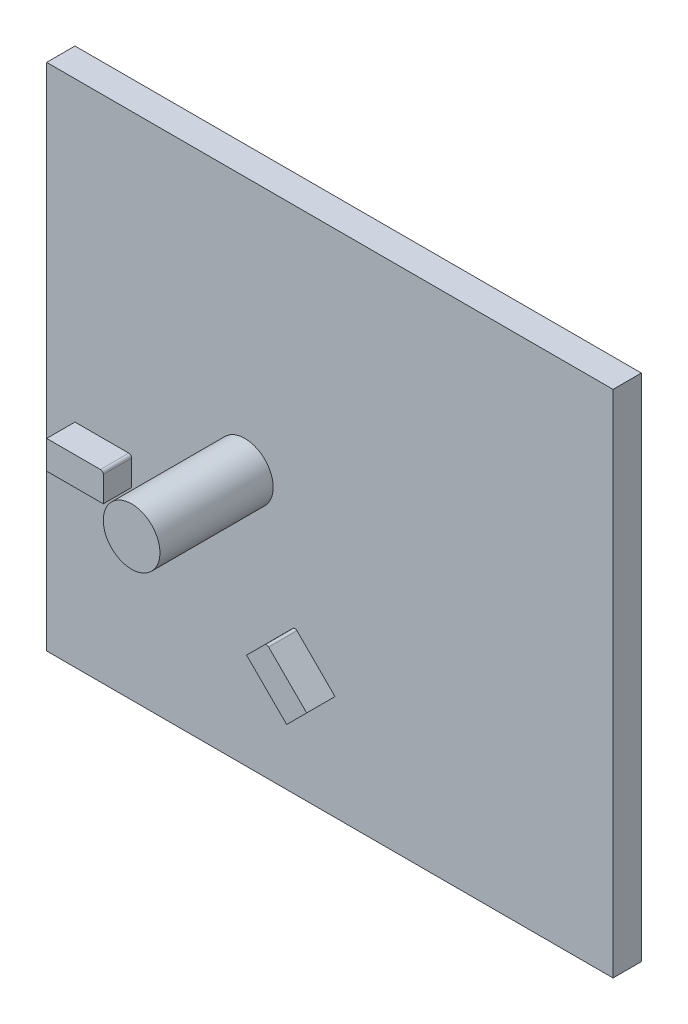
ISO-10303-21;
HEADER;
FILE_DESCRIPTION(('STEP AP214'),'2;1');
FILE_NAME('part.step','',(''),(''),'','','');
FILE_SCHEMA(('AUTOMOTIVE_DESIGN { 1 0 10303 214 1 1 1 1 }'));
ENDSEC;
DATA;
#1=APPLICATION_CONTEXT('core data for automotive mechanical design processes');
#2=APPLICATION_PROTOCOL_DEFINITION('international standard','automotive_design',2000,#1);
#3=PRODUCT_CONTEXT('',#1,'mechanical');
#4=PRODUCT('Part','Part','',(#3));
#5=PRODUCT_RELATED_PRODUCT_CATEGORY('part','',(#4));
#6=PRODUCT_DEFINITION_FORMATION('','',#4);
#7=PRODUCT_DEFINITION_CONTEXT('part definition',#1,'design');
#8=PRODUCT_DEFINITION('design','',#6,#7);
#9=PRODUCT_DEFINITION_SHAPE('','',#8);
#10=(LENGTH_UNIT() NAMED_UNIT(*) SI_UNIT(.MILLI.,.METRE.));
#11=(NAMED_UNIT(*) PLANE_ANGLE_UNIT() SI_UNIT($,.RADIAN.));
#12=(NAMED_UNIT(*) SI_UNIT($,.STERADIAN.) SOLID_ANGLE_UNIT());
#13=UNCERTAINTY_MEASURE_WITH_UNIT(LENGTH_MEASURE(1.E-05),#10,'distance_accuracy_value','');
#14=(GEOMETRIC_REPRESENTATION_CONTEXT(3) GLOBAL_UNCERTAINTY_ASSIGNED_CONTEXT((#13)) GLOBAL_UNIT_ASSIGNED_CONTEXT((#10,
#11,#12)) REPRESENTATION_CONTEXT('',''));
#15=CARTESIAN_POINT('',(0.,0.,0.));
#16=DIRECTION('',(0.,0.,1.));
#17=DIRECTION('',(1.,0.,0.));
#18=AXIS2_PLACEMENT_3D('',#15,#16,#17);
#19=CARTESIAN_POINT('',(-100.,-90.,10.));
#20=DIRECTION('',(0.,0.,-1.));
#21=DIRECTION('',(-1.,0.,0.));
#22=AXIS2_PLACEMENT_3D('',#19,#20,#21);
#23=PLANE('',#22);
#24=DIRECTION('',(0.,-1.,0.));
#25=VECTOR('',#24,1.);
#26=CARTESIAN_POINT('',(-90.,-25.,10.));
#27=LINE('',#26,#25);
#28=CARTESIAN_POINT('',(-90.,-15.,10.));
#29=VERTEX_POINT('',#28);
#30=CARTESIAN_POINT('',(-90.,-25.,10.));
#31=VERTEX_POINT('',#30);
#32=EDGE_CURVE('E166',#29,#31,#27,.T.);
#33=ORIENTED_EDGE('',*,*,#32,.F.);
#34=DIRECTION('',(-1.,0.,0.));
#35=VECTOR('',#34,1.);
#36=CARTESIAN_POINT('',(-70.,-15.,10.));
#37=LINE('',#36,#35);
#38=CARTESIAN_POINT('',(-71.,-15.,10.));
#39=VERTEX_POINT('',#38);
#40=EDGE_CURVE('E179',#39,#29,#37,.T.);
#41=ORIENTED_EDGE('',*,*,#40,.F.);
#42=CARTESIAN_POINT('',(-71.,-16.,10.));
#43=DIRECTION('',(0.,0.,-1.));
#44=DIRECTION('',(-1.,0.,0.));
#45=AXIS2_PLACEMENT_3D('',#42,#43,#44);
#46=CIRCLE('',#45,1.);
#47=CARTESIAN_POINT('',(-70.,-16.,10.));
#48=VERTEX_POINT('',#47);
#49=EDGE_CURVE('E12',#39,#48,#46,.T.);
#50=ORIENTED_EDGE('',*,*,#49,.T.);
#51=DIRECTION('',(0.,1.,0.));
#52=VECTOR('',#51,1.);
#53=CARTESIAN_POINT('',(-70.,-25.,10.));
#54=LINE('',#53,#52);
#55=CARTESIAN_POINT('',(-70.,-25.,10.));
#56=VERTEX_POINT('',#55);
#57=EDGE_CURVE('E188',#56,#48,#54,.T.);
#58=ORIENTED_EDGE('',*,*,#57,.F.);
#59=DIRECTION('',(1.,0.,0.));
#60=VECTOR('',#59,1.);
#61=CARTESIAN_POINT('',(-70.,-25.,10.));
#62=LINE('',#61,#60);
#63=EDGE_CURVE('E169',#31,#56,#62,.T.);
#64=ORIENTED_EDGE('',*,*,#63,.F.);
#65=EDGE_LOOP('',(#33,#41,#50,#58,#64));
#66=FACE_BOUND('',#65,.T.);
#67=DIRECTION('',(0.,-1.,0.));
#68=VECTOR('',#67,1.);
#69=CARTESIAN_POINT('',(-100.,90.,10.));
#70=LINE('',#69,#68);
#71=CARTESIAN_POINT('',(-100.,90.,10.));
#72=VERTEX_POINT('',#71);
#73=CARTESIAN_POINT('',(-100.,-90.,10.));
#74=VERTEX_POINT('',#73);
#75=EDGE_CURVE('E205',#72,#74,#70,.T.);
#76=ORIENTED_EDGE('',*,*,#75,.T.);
#77=DIRECTION('',(1.,0.,0.));
#78=VECTOR('',#77,1.);
#79=CARTESIAN_POINT('',(100.,-90.,10.));
#80=LINE('',#79,#78);
#81=CARTESIAN_POINT('',(100.,-90.,10.));
#82=VERTEX_POINT('',#81);
#83=EDGE_CURVE('E209',#74,#82,#80,.T.);
#84=ORIENTED_EDGE('',*,*,#83,.T.);
#85=DIRECTION('',(0.,1.,0.));
#86=VECTOR('',#85,1.);
#87=CARTESIAN_POINT('',(100.,90.,10.));
#88=LINE('',#87,#86);
#89=CARTESIAN_POINT('',(100.,90.,10.));
#90=VERTEX_POINT('',#89);
#91=EDGE_CURVE('E212',#82,#90,#88,.T.);
#92=ORIENTED_EDGE('',*,*,#91,.T.);
#93=DIRECTION('',(-1.,0.,0.));
#94=VECTOR('',#93,1.);
#95=CARTESIAN_POINT('',(100.,90.,10.));
#96=LINE('',#95,#94);
#97=EDGE_CURVE('E214',#90,#72,#96,.T.);
#98=ORIENTED_EDGE('',*,*,#97,.T.);
#99=EDGE_LOOP('',(#76,#84,#92,#98));
#100=FACE_BOUND('',#99,.T.);
#101=CARTESIAN_POINT('',(-30.,0.,10.));
#102=DIRECTION('',(0.,0.,1.));
#103=DIRECTION('',(1.,0.,0.));
#104=AXIS2_PLACEMENT_3D('',#101,#102,#103);
#105=CIRCLE('',#104,10.);
#106=CARTESIAN_POINT('',(-20.,0.,10.));
#107=VERTEX_POINT('',#106);
#108=EDGE_CURVE('E202',#107,#107,#105,.T.);
#109=ORIENTED_EDGE('',*,*,#108,.F.);
#110=EDGE_LOOP('',(#109));
#111=FACE_BOUND('',#110,.T.);
#112=DIRECTION('',(-0.707106781186543,-0.707106781186552,0.));
#113=VECTOR('',#112,1.);
#114=CARTESIAN_POINT('',(-12.3223304703361,-38.89087296526,10.));
#115=LINE('',#114,#113);
#116=CARTESIAN_POINT('',(-13.0294372515226,-39.5979797464466,10.));
#117=VERTEX_POINT('',#116);
#118=CARTESIAN_POINT('',(-19.3933982822015,-45.9619407771255,10.));
#119=VERTEX_POINT('',#118);
#120=EDGE_CURVE('E164',#117,#119,#115,.T.);
#121=ORIENTED_EDGE('',*,*,#120,.F.);
#122=CARTESIAN_POINT('',(-12.3223304703361,-40.3050865276331,10.));
#123=DIRECTION('',(0.,0.,-1.));
#124=DIRECTION('',(-1.,0.,0.));
#125=AXIS2_PLACEMENT_3D('',#122,#123,#124);
#126=CIRCLE('',#125,1.);
#127=CARTESIAN_POINT('',(-11.6152236891495,-39.5979797464466,10.));
#128=VERTEX_POINT('',#127);
#129=EDGE_CURVE('E47',#117,#128,#126,.T.);
#130=ORIENTED_EDGE('',*,*,#129,.T.);
#131=DIRECTION('',(-0.707106781186551,0.707106781186544,0.));
#132=VECTOR('',#131,1.);
#133=CARTESIAN_POINT('',(-12.3223304703361,-38.89087296526,10.));
#134=LINE('',#133,#132);
#135=CARTESIAN_POINT('',(1.81980515339494,-53.0330085889909,10.));
#136=VERTEX_POINT('',#135);
#137=EDGE_CURVE('E150',#136,#128,#134,.T.);
#138=ORIENTED_EDGE('',*,*,#137,.F.);
#139=DIRECTION('',(0.707106781186543,0.707106781186551,0.));
#140=VECTOR('',#139,1.);
#141=CARTESIAN_POINT('',(1.81980515339495,-53.0330085889909,10.));
#142=LINE('',#141,#140);
#143=CARTESIAN_POINT('',(-5.25126265847048,-60.1040764008564,10.));
#144=VERTEX_POINT('',#143);
#145=EDGE_CURVE('E255',#144,#136,#142,.T.);
#146=ORIENTED_EDGE('',*,*,#145,.F.);
#147=DIRECTION('',(0.707106781186551,-0.707106781186544,0.));
#148=VECTOR('',#147,1.);
#149=CARTESIAN_POINT('',(-19.3933982822015,-45.9619407771255,10.));
#150=LINE('',#149,#148);
#151=EDGE_CURVE('E461',#119,#144,#150,.T.);
#152=ORIENTED_EDGE('',*,*,#151,.F.);
#153=EDGE_LOOP('',(#121,#130,#138,#146,#152));
#154=FACE_BOUND('',#153,.T.);
#155=ADVANCED_FACE('F39',(#66,#100,#111,#154),#23,.F.);
#156=CARTESIAN_POINT('',(-100.,-90.,0.));
#157=DIRECTION('',(0.,0.,-1.));
#158=DIRECTION('',(-1.,0.,0.));
#159=AXIS2_PLACEMENT_3D('',#156,#157,#158);
#160=PLANE('',#159);
#161=DIRECTION('',(0.,-1.,0.));
#162=VECTOR('',#161,1.);
#163=CARTESIAN_POINT('',(-100.,90.,0.));
#164=LINE('',#163,#162);
#165=CARTESIAN_POINT('',(-100.,90.,0.));
#166=VERTEX_POINT('',#165);
#167=CARTESIAN_POINT('',(-100.,-90.,0.));
#168=VERTEX_POINT('',#167);
#169=EDGE_CURVE('E204',#166,#168,#164,.T.);
#170=ORIENTED_EDGE('',*,*,#169,.F.);
#171=DIRECTION('',(-1.,0.,0.));
#172=VECTOR('',#171,1.);
#173=CARTESIAN_POINT('',(100.,90.,0.));
#174=LINE('',#173,#172);
#175=CARTESIAN_POINT('',(100.,90.,0.));
#176=VERTEX_POINT('',#175);
#177=EDGE_CURVE('E210',#176,#166,#174,.T.);
#178=ORIENTED_EDGE('',*,*,#177,.F.);
#179=DIRECTION('',(0.,1.,0.));
#180=VECTOR('',#179,1.);
#181=CARTESIAN_POINT('',(100.,90.,0.));
#182=LINE('',#181,#180);
#183=CARTESIAN_POINT('',(100.,-90.,0.));
#184=VERTEX_POINT('',#183);
#185=EDGE_CURVE('E221',#184,#176,#182,.T.);
#186=ORIENTED_EDGE('',*,*,#185,.F.);
#187=DIRECTION('',(1.,0.,0.));
#188=VECTOR('',#187,1.);
#189=CARTESIAN_POINT('',(100.,-90.,0.));
#190=LINE('',#189,#188);
#191=EDGE_CURVE('E219',#168,#184,#190,.T.);
#192=ORIENTED_EDGE('',*,*,#191,.F.);
#193=EDGE_LOOP('',(#170,#178,#186,#192));
#194=FACE_BOUND('',#193,.T.);
#195=ADVANCED_FACE('F268',(#194),#160,.T.);
#196=CARTESIAN_POINT('',(-100.,90.,10.));
#197=DIRECTION('',(1.,0.,0.));
#198=DIRECTION('',(0.,1.,0.));
#199=AXIS2_PLACEMENT_3D('',#196,#197,#198);
#200=PLANE('',#199);
#201=ORIENTED_EDGE('',*,*,#169,.T.);
#202=DIRECTION('',(0.,0.,-1.));
#203=VECTOR('',#202,1.);
#204=CARTESIAN_POINT('',(-100.,-90.,10.));
#205=LINE('',#204,#203);
#206=EDGE_CURVE('E232',#74,#168,#205,.T.);
#207=ORIENTED_EDGE('',*,*,#206,.F.);
#208=ORIENTED_EDGE('',*,*,#75,.F.);
#209=DIRECTION('',(0.,0.,-1.));
#210=VECTOR('',#209,1.);
#211=CARTESIAN_POINT('',(-100.,90.,10.));
#212=LINE('',#211,#210);
#213=EDGE_CURVE('E216',#72,#166,#212,.T.);
#214=ORIENTED_EDGE('',*,*,#213,.T.);
#215=EDGE_LOOP('',(#201,#207,#208,#214));
#216=FACE_BOUND('',#215,.T.);
#217=ADVANCED_FACE('F275',(#216),#200,.F.);
#218=CARTESIAN_POINT('',(100.,-90.,10.));
#219=DIRECTION('',(0.,1.,0.));
#220=DIRECTION('',(-1.,0.,0.));
#221=AXIS2_PLACEMENT_3D('',#218,#219,#220);
#222=PLANE('',#221);
#223=ORIENTED_EDGE('',*,*,#191,.T.);
#224=DIRECTION('',(0.,0.,-1.));
#225=VECTOR('',#224,1.);
#226=CARTESIAN_POINT('',(100.,-90.,10.));
#227=LINE('',#226,#225);
#228=EDGE_CURVE('E229',#82,#184,#227,.T.);
#229=ORIENTED_EDGE('',*,*,#228,.F.);
#230=ORIENTED_EDGE('',*,*,#83,.F.);
#231=ORIENTED_EDGE('',*,*,#206,.T.);
#232=EDGE_LOOP('',(#223,#229,#230,#231));
#233=FACE_BOUND('',#232,.T.);
#234=ADVANCED_FACE('F291',(#233),#222,.F.);
#235=CARTESIAN_POINT('',(100.,90.,10.));
#236=DIRECTION('',(-1.,0.,0.));
#237=DIRECTION('',(0.,-1.,0.));
#238=AXIS2_PLACEMENT_3D('',#235,#236,#237);
#239=PLANE('',#238);
#240=ORIENTED_EDGE('',*,*,#185,.T.);
#241=DIRECTION('',(0.,0.,-1.));
#242=VECTOR('',#241,1.);
#243=CARTESIAN_POINT('',(100.,90.,10.));
#244=LINE('',#243,#242);
#245=EDGE_CURVE('E226',#90,#176,#244,.T.);
#246=ORIENTED_EDGE('',*,*,#245,.F.);
#247=ORIENTED_EDGE('',*,*,#91,.F.);
#248=ORIENTED_EDGE('',*,*,#228,.T.);
#249=EDGE_LOOP('',(#240,#246,#247,#248));
#250=FACE_BOUND('',#249,.T.);
#251=ADVANCED_FACE('F287',(#250),#239,.F.);
#252=CARTESIAN_POINT('',(100.,90.,10.));
#253=DIRECTION('',(0.,-1.,0.));
#254=DIRECTION('',(1.,0.,0.));
#255=AXIS2_PLACEMENT_3D('',#252,#253,#254);
#256=PLANE('',#255);
#257=ORIENTED_EDGE('',*,*,#177,.T.);
#258=ORIENTED_EDGE('',*,*,#213,.F.);
#259=ORIENTED_EDGE('',*,*,#97,.F.);
#260=ORIENTED_EDGE('',*,*,#245,.T.);
#261=EDGE_LOOP('',(#257,#258,#259,#260));
#262=FACE_BOUND('',#261,.T.);
#263=ADVANCED_FACE('F284',(#262),#256,.F.);
#264=CARTESIAN_POINT('',(-30.,0.,50.));
#265=DIRECTION('',(0.,0.,-1.));
#266=DIRECTION('',(-1.,0.,0.));
#267=AXIS2_PLACEMENT_3D('',#264,#265,#266);
#268=CYLINDRICAL_SURFACE('',#267,10.);
#269=CARTESIAN_POINT('',(-30.,0.,50.));
#270=DIRECTION('',(0.,0.,-1.));
#271=DIRECTION('',(-1.,0.,0.));
#272=AXIS2_PLACEMENT_3D('',#269,#270,#271);
#273=CIRCLE('',#272,10.);
#274=CARTESIAN_POINT('',(-40.,0.,50.));
#275=VERTEX_POINT('',#274);
#276=EDGE_CURVE('E199',#275,#275,#273,.T.);
#277=ORIENTED_EDGE('',*,*,#276,.T.);
#278=EDGE_LOOP('',(#277));
#279=FACE_BOUND('',#278,.T.);
#280=ORIENTED_EDGE('',*,*,#108,.T.);
#281=EDGE_LOOP('',(#280));
#282=FACE_BOUND('',#281,.T.);
#283=ADVANCED_FACE('F281',(#279,#282),#268,.T.);
#284=CARTESIAN_POINT('',(-30.,0.,50.));
#285=DIRECTION('',(0.,0.,-1.));
#286=DIRECTION('',(-1.,0.,0.));
#287=AXIS2_PLACEMENT_3D('',#284,#285,#286);
#288=PLANE('',#287);
#289=ORIENTED_EDGE('',*,*,#276,.F.);
#290=EDGE_LOOP('',(#289));
#291=FACE_BOUND('',#290,.T.);
#292=ADVANCED_FACE('F313',(#291),#288,.F.);
#293=CARTESIAN_POINT('',(-90.,-25.,20.));
#294=DIRECTION('',(1.,0.,0.));
#295=DIRECTION('',(0.,0.,-1.));
#296=AXIS2_PLACEMENT_3D('',#293,#294,#295);
#297=PLANE('',#296);
#298=ORIENTED_EDGE('',*,*,#32,.T.);
#299=DIRECTION('',(0.,0.,-1.));
#300=VECTOR('',#299,1.);
#301=CARTESIAN_POINT('',(-90.,-25.,20.));
#302=LINE('',#301,#300);
#303=CARTESIAN_POINT('',(-90.,-25.,20.));
#304=VERTEX_POINT('',#303);
#305=EDGE_CURVE('E196',#304,#31,#302,.T.);
#306=ORIENTED_EDGE('',*,*,#305,.F.);
#307=DIRECTION('',(0.,-1.,0.));
#308=VECTOR('',#307,1.);
#309=CARTESIAN_POINT('',(-90.,-25.,20.));
#310=LINE('',#309,#308);
#311=CARTESIAN_POINT('',(-90.,-15.,20.));
#312=VERTEX_POINT('',#311);
#313=EDGE_CURVE('E175',#312,#304,#310,.T.);
#314=ORIENTED_EDGE('',*,*,#313,.F.);
#315=DIRECTION('',(0.,0.,-1.));
#316=VECTOR('',#315,1.);
#317=CARTESIAN_POINT('',(-90.,-15.,20.));
#318=LINE('',#317,#316);
#319=EDGE_CURVE('E184',#312,#29,#318,.T.);
#320=ORIENTED_EDGE('',*,*,#319,.T.);
#321=EDGE_LOOP('',(#298,#306,#314,#320));
#322=FACE_BOUND('',#321,.T.);
#323=ADVANCED_FACE('F318',(#322),#297,.F.);
#324=CARTESIAN_POINT('',(-70.,-25.,20.));
#325=DIRECTION('',(0.,1.,0.));
#326=DIRECTION('',(-1.,0.,0.));
#327=AXIS2_PLACEMENT_3D('',#324,#325,#326);
#328=PLANE('',#327);
#329=ORIENTED_EDGE('',*,*,#63,.T.);
#330=DIRECTION('',(0.,0.,-1.));
#331=VECTOR('',#330,1.);
#332=CARTESIAN_POINT('',(-70.,-25.,20.));
#333=LINE('',#332,#331);
#334=CARTESIAN_POINT('',(-70.,-25.,20.));
#335=VERTEX_POINT('',#334);
#336=EDGE_CURVE('E193',#335,#56,#333,.T.);
#337=ORIENTED_EDGE('',*,*,#336,.F.);
#338=DIRECTION('',(1.,0.,0.));
#339=VECTOR('',#338,1.);
#340=CARTESIAN_POINT('',(-70.,-25.,20.));
#341=LINE('',#340,#339);
#342=EDGE_CURVE('E178',#304,#335,#341,.T.);
#343=ORIENTED_EDGE('',*,*,#342,.F.);
#344=ORIENTED_EDGE('',*,*,#305,.T.);
#345=EDGE_LOOP('',(#329,#337,#343,#344));
#346=FACE_BOUND('',#345,.T.);
#347=ADVANCED_FACE('F324',(#346),#328,.F.);
#348=CARTESIAN_POINT('',(-70.,-25.,20.));
#349=DIRECTION('',(-1.,0.,0.));
#350=DIRECTION('',(0.,-1.,0.));
#351=AXIS2_PLACEMENT_3D('',#348,#349,#350);
#352=PLANE('',#351);
#353=ORIENTED_EDGE('',*,*,#57,.T.);
#354=DIRECTION('',(0.,0.,-1.));
#355=VECTOR('',#354,1.);
#356=CARTESIAN_POINT('',(-70.,-16.,20.));
#357=LINE('',#356,#355);
#358=CARTESIAN_POINT('',(-70.,-16.,20.));
#359=VERTEX_POINT('',#358);
#360=EDGE_CURVE('E54',#48,#359,#357,.F.);
#361=ORIENTED_EDGE('',*,*,#360,.T.);
#362=DIRECTION('',(0.,1.,0.));
#363=VECTOR('',#362,1.);
#364=CARTESIAN_POINT('',(-70.,-25.,20.));
#365=LINE('',#364,#363);
#366=EDGE_CURVE('E181',#335,#359,#365,.T.);
#367=ORIENTED_EDGE('',*,*,#366,.F.);
#368=ORIENTED_EDGE('',*,*,#336,.T.);
#369=EDGE_LOOP('',(#353,#361,#367,#368));
#370=FACE_BOUND('',#369,.T.);
#371=ADVANCED_FACE('F330',(#370),#352,.F.);
#372=CARTESIAN_POINT('',(-70.,-15.,20.));
#373=DIRECTION('',(0.,-1.,0.));
#374=DIRECTION('',(1.,0.,0.));
#375=AXIS2_PLACEMENT_3D('',#372,#373,#374);
#376=PLANE('',#375);
#377=DIRECTION('',(-1.,0.,0.));
#378=VECTOR('',#377,1.);
#379=CARTESIAN_POINT('',(-70.,-15.,20.));
#380=LINE('',#379,#378);
#381=CARTESIAN_POINT('',(-71.,-15.,20.));
#382=VERTEX_POINT('',#381);
#383=EDGE_CURVE('E183',#382,#312,#380,.T.);
#384=ORIENTED_EDGE('',*,*,#383,.F.);
#385=DIRECTION('',(0.,0.,-1.));
#386=VECTOR('',#385,1.);
#387=CARTESIAN_POINT('',(-71.,-15.,20.));
#388=LINE('',#387,#386);
#389=EDGE_CURVE('E240',#382,#39,#388,.T.);
#390=ORIENTED_EDGE('',*,*,#389,.T.);
#391=ORIENTED_EDGE('',*,*,#40,.T.);
#392=ORIENTED_EDGE('',*,*,#319,.F.);
#393=EDGE_LOOP('',(#384,#390,#391,#392));
#394=FACE_BOUND('',#393,.T.);
#395=ADVANCED_FACE('F333',(#394),#376,.F.);
#396=CARTESIAN_POINT('',(-90.,-15.,20.));
#397=DIRECTION('',(0.,0.,1.));
#398=DIRECTION('',(1.,0.,0.));
#399=AXIS2_PLACEMENT_3D('',#396,#397,#398);
#400=PLANE('',#399);
#401=ORIENTED_EDGE('',*,*,#366,.T.);
#402=CARTESIAN_POINT('',(-71.,-16.,20.));
#403=DIRECTION('',(0.,0.,1.));
#404=DIRECTION('',(1.,0.,0.));
#405=AXIS2_PLACEMENT_3D('',#402,#403,#404);
#406=CIRCLE('',#405,1.);
#407=EDGE_CURVE('E244',#359,#382,#406,.T.);
#408=ORIENTED_EDGE('',*,*,#407,.T.);
#409=ORIENTED_EDGE('',*,*,#383,.T.);
#410=ORIENTED_EDGE('',*,*,#313,.T.);
#411=ORIENTED_EDGE('',*,*,#342,.T.);
#412=EDGE_LOOP('',(#401,#408,#409,#410,#411));
#413=FACE_BOUND('',#412,.T.);
#414=ADVANCED_FACE('F336',(#413),#400,.T.);
#415=CARTESIAN_POINT('',(-12.3223304703361,-38.89087296526,20.));
#416=DIRECTION('',(0.707106781186552,-0.707106781186543,0.));
#417=DIRECTION('',(0.707106781186543,0.707106781186552,0.));
#418=AXIS2_PLACEMENT_3D('',#415,#416,#417);
#419=PLANE('',#418);
#420=DIRECTION('',(-0.707106781186543,-0.707106781186552,0.));
#421=VECTOR('',#420,1.);
#422=CARTESIAN_POINT('',(-12.3223304703361,-38.89087296526,20.));
#423=LINE('',#422,#421);
#424=CARTESIAN_POINT('',(-13.0294372515226,-39.5979797464466,20.));
#425=VERTEX_POINT('',#424);
#426=CARTESIAN_POINT('',(-19.3933982822015,-45.9619407771255,20.));
#427=VERTEX_POINT('',#426);
#428=EDGE_CURVE('E138',#425,#427,#423,.T.);
#429=ORIENTED_EDGE('',*,*,#428,.F.);
#430=DIRECTION('',(0.,0.,-1.));
#431=VECTOR('',#430,1.);
#432=CARTESIAN_POINT('',(-13.0294372515226,-39.5979797464466,20.));
#433=LINE('',#432,#431);
#434=EDGE_CURVE('E235',#425,#117,#433,.T.);
#435=ORIENTED_EDGE('',*,*,#434,.T.);
#436=ORIENTED_EDGE('',*,*,#120,.T.);
#437=DIRECTION('',(0.,0.,-1.));
#438=VECTOR('',#437,1.);
#439=CARTESIAN_POINT('',(-19.3933982822015,-45.9619407771255,20.));
#440=LINE('',#439,#438);
#441=EDGE_CURVE('E156',#427,#119,#440,.T.);
#442=ORIENTED_EDGE('',*,*,#441,.F.);
#443=EDGE_LOOP('',(#429,#435,#436,#442));
#444=FACE_BOUND('',#443,.T.);
#445=ADVANCED_FACE('F162',(#444),#419,.F.);
#446=CARTESIAN_POINT('',(-19.3933982822015,-45.9619407771255,20.));
#447=DIRECTION('',(0.707106781186544,0.707106781186551,0.));
#448=DIRECTION('',(-0.707106781186551,0.707106781186544,0.));
#449=AXIS2_PLACEMENT_3D('',#446,#447,#448);
#450=PLANE('',#449);
#451=ORIENTED_EDGE('',*,*,#151,.T.);
#452=DIRECTION('',(0.,0.,-1.));
#453=VECTOR('',#452,1.);
#454=CARTESIAN_POINT('',(-5.25126265847049,-60.1040764008564,20.));
#455=LINE('',#454,#453);
#456=CARTESIAN_POINT('',(-5.25126265847049,-60.1040764008564,20.));
#457=VERTEX_POINT('',#456);
#458=EDGE_CURVE('E158',#457,#144,#455,.T.);
#459=ORIENTED_EDGE('',*,*,#458,.F.);
#460=DIRECTION('',(0.707106781186551,-0.707106781186544,0.));
#461=VECTOR('',#460,1.);
#462=CARTESIAN_POINT('',(-19.3933982822015,-45.9619407771255,20.));
#463=LINE('',#462,#461);
#464=EDGE_CURVE('E142',#427,#457,#463,.T.);
#465=ORIENTED_EDGE('',*,*,#464,.F.);
#466=ORIENTED_EDGE('',*,*,#441,.T.);
#467=EDGE_LOOP('',(#451,#459,#465,#466));
#468=FACE_BOUND('',#467,.T.);
#469=ADVANCED_FACE('F155',(#468),#450,.F.);
#470=CARTESIAN_POINT('',(1.81980515339495,-53.0330085889909,20.));
#471=DIRECTION('',(-0.707106781186552,0.707106781186544,0.));
#472=DIRECTION('',(-0.707106781186544,-0.707106781186552,0.));
#473=AXIS2_PLACEMENT_3D('',#470,#471,#472);
#474=PLANE('',#473);
#475=ORIENTED_EDGE('',*,*,#145,.T.);
#476=DIRECTION('',(0.,0.,-1.));
#477=VECTOR('',#476,1.);
#478=CARTESIAN_POINT('',(1.81980515339495,-53.0330085889909,20.));
#479=LINE('',#478,#477);
#480=CARTESIAN_POINT('',(1.81980515339495,-53.0330085889909,20.));
#481=VERTEX_POINT('',#480);
#482=EDGE_CURVE('E171',#481,#136,#479,.T.);
#483=ORIENTED_EDGE('',*,*,#482,.F.);
#484=DIRECTION('',(0.707106781186543,0.707106781186551,0.));
#485=VECTOR('',#484,1.);
#486=CARTESIAN_POINT('',(1.81980515339495,-53.0330085889909,20.));
#487=LINE('',#486,#485);
#488=EDGE_CURVE('E160',#457,#481,#487,.T.);
#489=ORIENTED_EDGE('',*,*,#488,.F.);
#490=ORIENTED_EDGE('',*,*,#458,.T.);
#491=EDGE_LOOP('',(#475,#483,#489,#490));
#492=FACE_BOUND('',#491,.T.);
#493=ADVANCED_FACE('F345',(#492),#474,.F.);
#494=CARTESIAN_POINT('',(-12.3223304703361,-38.89087296526,20.));
#495=DIRECTION('',(-0.707106781186544,-0.707106781186551,0.));
#496=DIRECTION('',(0.707106781186551,-0.707106781186544,0.));
#497=AXIS2_PLACEMENT_3D('',#494,#495,#496);
#498=PLANE('',#497);
#499=ORIENTED_EDGE('',*,*,#137,.T.);
#500=DIRECTION('',(0.,0.,-1.));
#501=VECTOR('',#500,1.);
#502=CARTESIAN_POINT('',(-11.6152236891495,-39.5979797464466,20.));
#503=LINE('',#502,#501);
#504=CARTESIAN_POINT('',(-11.6152236891495,-39.5979797464466,20.));
#505=VERTEX_POINT('',#504);
#506=EDGE_CURVE('E237',#128,#505,#503,.F.);
#507=ORIENTED_EDGE('',*,*,#506,.T.);
#508=DIRECTION('',(-0.707106781186551,0.707106781186544,0.));
#509=VECTOR('',#508,1.);
#510=CARTESIAN_POINT('',(-12.3223304703361,-38.89087296526,20.));
#511=LINE('',#510,#509);
#512=EDGE_CURVE('E465',#481,#505,#511,.T.);
#513=ORIENTED_EDGE('',*,*,#512,.F.);
#514=ORIENTED_EDGE('',*,*,#482,.T.);
#515=EDGE_LOOP('',(#499,#507,#513,#514));
#516=FACE_BOUND('',#515,.T.);
#517=ADVANCED_FACE('F252',(#516),#498,.F.);
#518=CARTESIAN_POINT('',(-19.3933982822015,-45.9619407771255,20.));
#519=DIRECTION('',(0.,0.,1.));
#520=DIRECTION('',(1.,0.,0.));
#521=AXIS2_PLACEMENT_3D('',#518,#519,#520);
#522=PLANE('',#521);
#523=ORIENTED_EDGE('',*,*,#512,.T.);
#524=CARTESIAN_POINT('',(-12.3223304703361,-40.3050865276331,20.));
#525=DIRECTION('',(0.,0.,1.));
#526=DIRECTION('',(1.,0.,0.));
#527=AXIS2_PLACEMENT_3D('',#524,#525,#526);
#528=CIRCLE('',#527,1.);
#529=EDGE_CURVE('E145',#505,#425,#528,.T.);
#530=ORIENTED_EDGE('',*,*,#529,.T.);
#531=ORIENTED_EDGE('',*,*,#428,.T.);
#532=ORIENTED_EDGE('',*,*,#464,.T.);
#533=ORIENTED_EDGE('',*,*,#488,.T.);
#534=EDGE_LOOP('',(#523,#530,#531,#532,#533));
#535=FACE_BOUND('',#534,.T.);
#536=ADVANCED_FACE('F141',(#535),#522,.T.);
#537=CARTESIAN_POINT('',(-12.3223304703361,-40.3050865276331,20.));
#538=DIRECTION('',(0.,0.,-1.));
#539=DIRECTION('',(-1.,0.,0.));
#540=AXIS2_PLACEMENT_3D('',#537,#538,#539);
#541=CYLINDRICAL_SURFACE('',#540,1.);
#542=ORIENTED_EDGE('',*,*,#529,.F.);
#543=ORIENTED_EDGE('',*,*,#506,.F.);
#544=ORIENTED_EDGE('',*,*,#129,.F.);
#545=ORIENTED_EDGE('',*,*,#434,.F.);
#546=EDGE_LOOP('',(#542,#543,#544,#545));
#547=FACE_BOUND('',#546,.T.);
#548=ADVANCED_FACE('F257',(#547),#541,.T.);
#549=CARTESIAN_POINT('',(-71.,-16.,20.));
#550=DIRECTION('',(0.,0.,-1.));
#551=DIRECTION('',(-1.,0.,0.));
#552=AXIS2_PLACEMENT_3D('',#549,#550,#551);
#553=CYLINDRICAL_SURFACE('',#552,1.);
#554=ORIENTED_EDGE('',*,*,#407,.F.);
#555=ORIENTED_EDGE('',*,*,#360,.F.);
#556=ORIENTED_EDGE('',*,*,#49,.F.);
#557=ORIENTED_EDGE('',*,*,#389,.F.);
#558=EDGE_LOOP('',(#554,#555,#556,#557));
#559=FACE_BOUND('',#558,.T.);
#560=ADVANCED_FACE('F41',(#559),#553,.T.);
#561=CLOSED_SHELL('',(#155,#195,#217,#234,#251,#263,#283,#292,#323,#347,#371,#395,#414,#445,
#469,#493,#517,#536,#548,#560));
#562=MANIFOLD_SOLID_BREP('B2',#561);
#563=ADVANCED_BREP_SHAPE_REPRESENTATION('',(#18,#562),#14);
#564=SHAPE_DEFINITION_REPRESENTATION(#9,#563);
ENDSEC;
END-ISO-10303-21;
